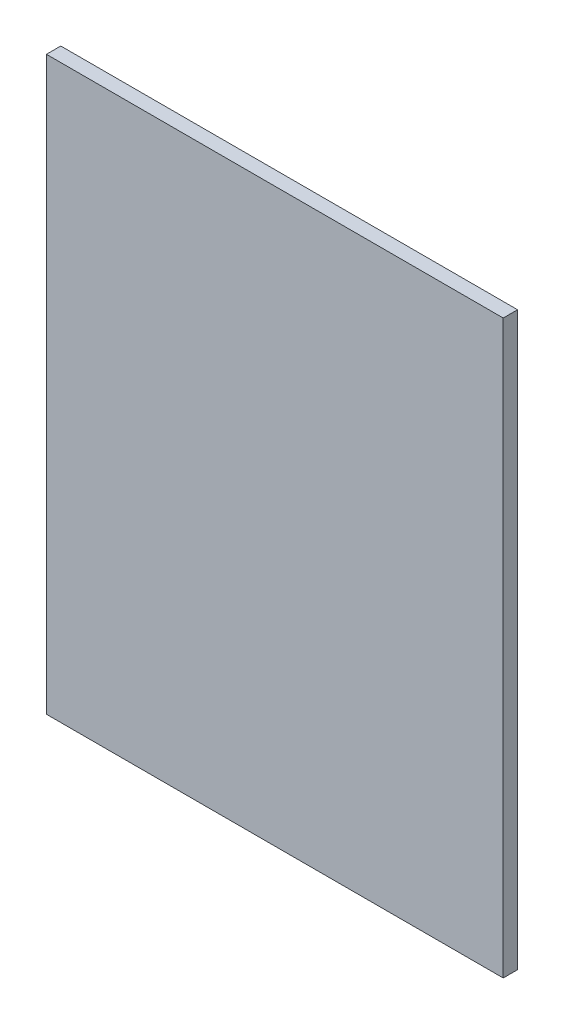
ISO-10303-21;
HEADER;
FILE_DESCRIPTION(('STEP AP214'),'2;1');
FILE_NAME('part.step','',(''),(''),'','','');
FILE_SCHEMA(('AUTOMOTIVE_DESIGN { 1 0 10303 214 1 1 1 1 }'));
ENDSEC;
DATA;
#1=APPLICATION_CONTEXT('core data for automotive mechanical design processes');
#2=APPLICATION_PROTOCOL_DEFINITION('international standard','automotive_design',2000,#1);
#3=PRODUCT_CONTEXT('',#1,'mechanical');
#4=PRODUCT('Part','Part','',(#3));
#5=PRODUCT_RELATED_PRODUCT_CATEGORY('part','',(#4));
#6=PRODUCT_DEFINITION_FORMATION('','',#4);
#7=PRODUCT_DEFINITION_CONTEXT('part definition',#1,'design');
#8=PRODUCT_DEFINITION('design','',#6,#7);
#9=PRODUCT_DEFINITION_SHAPE('','',#8);
#10=(LENGTH_UNIT() NAMED_UNIT(*) SI_UNIT(.MILLI.,.METRE.));
#11=(NAMED_UNIT(*) PLANE_ANGLE_UNIT() SI_UNIT($,.RADIAN.));
#12=(NAMED_UNIT(*) SI_UNIT($,.STERADIAN.) SOLID_ANGLE_UNIT());
#13=UNCERTAINTY_MEASURE_WITH_UNIT(LENGTH_MEASURE(1.E-05),#10,'distance_accuracy_value','');
#14=(GEOMETRIC_REPRESENTATION_CONTEXT(3) GLOBAL_UNCERTAINTY_ASSIGNED_CONTEXT((#13)) GLOBAL_UNIT_ASSIGNED_CONTEXT((#10,
#11,#12)) REPRESENTATION_CONTEXT('',''));
#15=CARTESIAN_POINT('',(0.,0.,0.));
#16=DIRECTION('',(0.,0.,1.));
#17=DIRECTION('',(1.,0.,0.));
#18=AXIS2_PLACEMENT_3D('',#15,#16,#17);
#19=CARTESIAN_POINT('',(1990.,2490.,125.));
#20=DIRECTION('',(-1.,0.,0.));
#21=DIRECTION('',(0.,-1.,0.));
#22=AXIS2_PLACEMENT_3D('',#19,#20,#21);
#23=PLANE('',#22);
#24=DIRECTION('',(0.,1.,0.));
#25=VECTOR('',#24,1.);
#26=CARTESIAN_POINT('',(1990.,2490.,0.));
#27=LINE('',#26,#25);
#28=CARTESIAN_POINT('',(1990.,-2490.,0.));
#29=VERTEX_POINT('',#28);
#30=CARTESIAN_POINT('',(1990.,2490.,0.));
#31=VERTEX_POINT('',#30);
#32=EDGE_CURVE('E109',#29,#31,#27,.T.);
#33=ORIENTED_EDGE('',*,*,#32,.T.);
#34=DIRECTION('',(0.,0.,-1.));
#35=VECTOR('',#34,1.);
#36=CARTESIAN_POINT('',(1990.,2490.,125.));
#37=LINE('',#36,#35);
#38=CARTESIAN_POINT('',(1990.,2490.,125.));
#39=VERTEX_POINT('',#38);
#40=EDGE_CURVE('E11',#39,#31,#37,.T.);
#41=ORIENTED_EDGE('',*,*,#40,.F.);
#42=DIRECTION('',(0.,1.,0.));
#43=VECTOR('',#42,1.);
#44=CARTESIAN_POINT('',(1990.,2490.,125.));
#45=LINE('',#44,#43);
#46=CARTESIAN_POINT('',(1990.,-2490.,125.));
#47=VERTEX_POINT('',#46);
#48=EDGE_CURVE('E93',#47,#39,#45,.T.);
#49=ORIENTED_EDGE('',*,*,#48,.F.);
#50=DIRECTION('',(0.,0.,-1.));
#51=VECTOR('',#50,1.);
#52=CARTESIAN_POINT('',(1990.,-2490.,125.));
#53=LINE('',#52,#51);
#54=EDGE_CURVE('E105',#47,#29,#53,.T.);
#55=ORIENTED_EDGE('',*,*,#54,.T.);
#56=EDGE_LOOP('',(#33,#41,#49,#55));
#57=FACE_BOUND('',#56,.T.);
#58=ADVANCED_FACE('F41',(#57),#23,.F.);
#59=CARTESIAN_POINT('',(-1990.,2490.,125.));
#60=DIRECTION('',(0.,-1.,0.));
#61=DIRECTION('',(0.,0.,-1.));
#62=AXIS2_PLACEMENT_3D('',#59,#60,#61);
#63=PLANE('',#62);
#64=DIRECTION('',(-1.,0.,0.));
#65=VECTOR('',#64,1.);
#66=CARTESIAN_POINT('',(-1990.,2490.,0.));
#67=LINE('',#66,#65);
#68=CARTESIAN_POINT('',(-1990.,2490.,0.));
#69=VERTEX_POINT('',#68);
#70=EDGE_CURVE('E98',#31,#69,#67,.T.);
#71=ORIENTED_EDGE('',*,*,#70,.T.);
#72=DIRECTION('',(0.,0.,-1.));
#73=VECTOR('',#72,1.);
#74=CARTESIAN_POINT('',(-1990.,2490.,125.));
#75=LINE('',#74,#73);
#76=CARTESIAN_POINT('',(-1990.,2490.,125.));
#77=VERTEX_POINT('',#76);
#78=EDGE_CURVE('E50',#77,#69,#75,.T.);
#79=ORIENTED_EDGE('',*,*,#78,.F.);
#80=DIRECTION('',(-1.,0.,0.));
#81=VECTOR('',#80,1.);
#82=CARTESIAN_POINT('',(-1990.,2490.,125.));
#83=LINE('',#82,#81);
#84=EDGE_CURVE('E88',#39,#77,#83,.T.);
#85=ORIENTED_EDGE('',*,*,#84,.F.);
#86=ORIENTED_EDGE('',*,*,#40,.T.);
#87=EDGE_LOOP('',(#71,#79,#85,#86));
#88=FACE_BOUND('',#87,.T.);
#89=ADVANCED_FACE('F97',(#88),#63,.F.);
#90=CARTESIAN_POINT('',(-1990.,2490.,125.));
#91=DIRECTION('',(1.,0.,0.));
#92=DIRECTION('',(0.,1.,0.));
#93=AXIS2_PLACEMENT_3D('',#90,#91,#92);
#94=PLANE('',#93);
#95=DIRECTION('',(0.,-1.,0.));
#96=VECTOR('',#95,1.);
#97=CARTESIAN_POINT('',(-1990.,2490.,0.));
#98=LINE('',#97,#96);
#99=CARTESIAN_POINT('',(-1990.,-2490.,0.));
#100=VERTEX_POINT('',#99);
#101=EDGE_CURVE('E75',#69,#100,#98,.T.);
#102=ORIENTED_EDGE('',*,*,#101,.T.);
#103=DIRECTION('',(0.,0.,-1.));
#104=VECTOR('',#103,1.);
#105=CARTESIAN_POINT('',(-1990.,-2490.,125.));
#106=LINE('',#105,#104);
#107=CARTESIAN_POINT('',(-1990.,-2490.,125.));
#108=VERTEX_POINT('',#107);
#109=EDGE_CURVE('E100',#108,#100,#106,.T.);
#110=ORIENTED_EDGE('',*,*,#109,.F.);
#111=DIRECTION('',(0.,-1.,0.));
#112=VECTOR('',#111,1.);
#113=CARTESIAN_POINT('',(-1990.,2490.,125.));
#114=LINE('',#113,#112);
#115=EDGE_CURVE('E91',#77,#108,#114,.T.);
#116=ORIENTED_EDGE('',*,*,#115,.F.);
#117=ORIENTED_EDGE('',*,*,#78,.T.);
#118=EDGE_LOOP('',(#102,#110,#116,#117));
#119=FACE_BOUND('',#118,.T.);
#120=ADVANCED_FACE('F101',(#119),#94,.F.);
#121=CARTESIAN_POINT('',(-1990.,-2490.,125.));
#122=DIRECTION('',(0.,1.,0.));
#123=DIRECTION('',(0.,0.,1.));
#124=AXIS2_PLACEMENT_3D('',#121,#122,#123);
#125=PLANE('',#124);
#126=DIRECTION('',(1.,0.,0.));
#127=VECTOR('',#126,1.);
#128=CARTESIAN_POINT('',(-1990.,-2490.,0.));
#129=LINE('',#128,#127);
#130=EDGE_CURVE('E81',#100,#29,#129,.T.);
#131=ORIENTED_EDGE('',*,*,#130,.T.);
#132=ORIENTED_EDGE('',*,*,#54,.F.);
#133=DIRECTION('',(1.,0.,0.));
#134=VECTOR('',#133,1.);
#135=CARTESIAN_POINT('',(-1990.,-2490.,125.));
#136=LINE('',#135,#134);
#137=EDGE_CURVE('E58',#108,#47,#136,.T.);
#138=ORIENTED_EDGE('',*,*,#137,.F.);
#139=ORIENTED_EDGE('',*,*,#109,.T.);
#140=EDGE_LOOP('',(#131,#132,#138,#139));
#141=FACE_BOUND('',#140,.T.);
#142=ADVANCED_FACE('F122',(#141),#125,.F.);
#143=CARTESIAN_POINT('',(0.,0.,125.));
#144=DIRECTION('',(0.,0.,1.));
#145=DIRECTION('',(1.,0.,0.));
#146=AXIS2_PLACEMENT_3D('',#143,#144,#145);
#147=PLANE('',#146);
#148=ORIENTED_EDGE('',*,*,#48,.T.);
#149=ORIENTED_EDGE('',*,*,#84,.T.);
#150=ORIENTED_EDGE('',*,*,#115,.T.);
#151=ORIENTED_EDGE('',*,*,#137,.T.);
#152=EDGE_LOOP('',(#148,#149,#150,#151));
#153=FACE_BOUND('',#152,.T.);
#154=ADVANCED_FACE('F89',(#153),#147,.T.);
#155=CARTESIAN_POINT('',(0.,0.,0.));
#156=DIRECTION('',(0.,0.,1.));
#157=DIRECTION('',(1.,0.,0.));
#158=AXIS2_PLACEMENT_3D('',#155,#156,#157);
#159=PLANE('',#158);
#160=ORIENTED_EDGE('',*,*,#32,.F.);
#161=ORIENTED_EDGE('',*,*,#130,.F.);
#162=ORIENTED_EDGE('',*,*,#101,.F.);
#163=ORIENTED_EDGE('',*,*,#70,.F.);
#164=EDGE_LOOP('',(#160,#161,#162,#163));
#165=FACE_BOUND('',#164,.T.);
#166=ADVANCED_FACE('F125',(#165),#159,.F.);
#167=CLOSED_SHELL('',(#58,#89,#120,#142,#154,#166));
#168=MANIFOLD_SOLID_BREP('B2',#167);
#169=ADVANCED_BREP_SHAPE_REPRESENTATION('',(#18,#168),#14);
#170=SHAPE_DEFINITION_REPRESENTATION(#9,#169);
ENDSEC;
END-ISO-10303-21;
